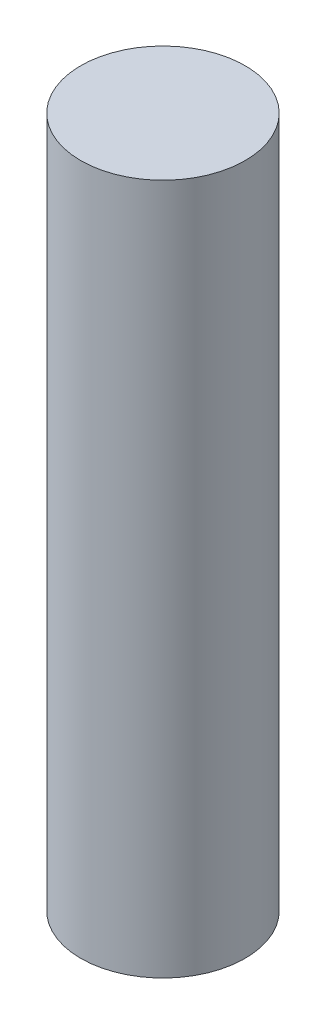
ISO-10303-21;
HEADER;
FILE_DESCRIPTION(('STEP AP214'),'2;1');
FILE_NAME('part.step','',(''),(''),'','','');
FILE_SCHEMA(('AUTOMOTIVE_DESIGN { 1 0 10303 214 1 1 1 1 }'));
ENDSEC;
DATA;
#1=APPLICATION_CONTEXT('core data for automotive mechanical design processes');
#2=APPLICATION_PROTOCOL_DEFINITION('international standard','automotive_design',2000,#1);
#3=PRODUCT_CONTEXT('',#1,'mechanical');
#4=PRODUCT('Part','Part','',(#3));
#5=PRODUCT_RELATED_PRODUCT_CATEGORY('part','',(#4));
#6=PRODUCT_DEFINITION_FORMATION('','',#4);
#7=PRODUCT_DEFINITION_CONTEXT('part definition',#1,'design');
#8=PRODUCT_DEFINITION('design','',#6,#7);
#9=PRODUCT_DEFINITION_SHAPE('','',#8);
#10=(LENGTH_UNIT() NAMED_UNIT(*) SI_UNIT(.MILLI.,.METRE.));
#11=(NAMED_UNIT(*) PLANE_ANGLE_UNIT() SI_UNIT($,.RADIAN.));
#12=(NAMED_UNIT(*) SI_UNIT($,.STERADIAN.) SOLID_ANGLE_UNIT());
#13=UNCERTAINTY_MEASURE_WITH_UNIT(LENGTH_MEASURE(1.E-05),#10,'distance_accuracy_value','');
#14=(GEOMETRIC_REPRESENTATION_CONTEXT(3) GLOBAL_UNCERTAINTY_ASSIGNED_CONTEXT((#13)) GLOBAL_UNIT_ASSIGNED_CONTEXT((#10,
#11,#12)) REPRESENTATION_CONTEXT('',''));
#15=CARTESIAN_POINT('',(0.,0.,0.));
#16=DIRECTION('',(0.,0.,1.));
#17=DIRECTION('',(1.,0.,0.));
#18=AXIS2_PLACEMENT_3D('',#15,#16,#17);
#19=CARTESIAN_POINT('',(0.,100.,0.));
#20=DIRECTION('',(0.,-1.,0.));
#21=DIRECTION('',(0.,0.,-1.));
#22=AXIS2_PLACEMENT_3D('',#19,#20,#21);
#23=CYLINDRICAL_SURFACE('',#22,11.9);
#24=CARTESIAN_POINT('',(0.,100.,0.));
#25=DIRECTION('',(0.,1.,0.));
#26=DIRECTION('',(0.,0.,1.));
#27=AXIS2_PLACEMENT_3D('',#24,#25,#26);
#28=CIRCLE('',#27,11.9);
#29=CARTESIAN_POINT('',(0.,100.,11.9));
#30=VERTEX_POINT('',#29);
#31=EDGE_CURVE('E10',#30,#30,#28,.T.);
#32=ORIENTED_EDGE('',*,*,#31,.F.);
#33=EDGE_LOOP('',(#32));
#34=FACE_BOUND('',#33,.T.);
#35=CARTESIAN_POINT('',(0.,0.,0.));
#36=DIRECTION('',(0.,1.,0.));
#37=DIRECTION('',(0.,0.,1.));
#38=AXIS2_PLACEMENT_3D('',#35,#36,#37);
#39=CIRCLE('',#38,11.9);
#40=CARTESIAN_POINT('',(0.,0.,11.9));
#41=VERTEX_POINT('',#40);
#42=EDGE_CURVE('E34',#41,#41,#39,.T.);
#43=ORIENTED_EDGE('',*,*,#42,.T.);
#44=EDGE_LOOP('',(#43));
#45=FACE_BOUND('',#44,.T.);
#46=ADVANCED_FACE('F31',(#34,#45),#23,.T.);
#47=CARTESIAN_POINT('',(0.,100.,0.));
#48=DIRECTION('',(0.,1.,0.));
#49=DIRECTION('',(0.,0.,1.));
#50=AXIS2_PLACEMENT_3D('',#47,#48,#49);
#51=PLANE('',#50);
#52=ORIENTED_EDGE('',*,*,#31,.T.);
#53=EDGE_LOOP('',(#52));
#54=FACE_BOUND('',#53,.T.);
#55=ADVANCED_FACE('F46',(#54),#51,.T.);
#56=CARTESIAN_POINT('',(0.,0.,0.));
#57=DIRECTION('',(0.,1.,0.));
#58=DIRECTION('',(0.,0.,1.));
#59=AXIS2_PLACEMENT_3D('',#56,#57,#58);
#60=PLANE('',#59);
#61=ORIENTED_EDGE('',*,*,#42,.F.);
#62=EDGE_LOOP('',(#61));
#63=FACE_BOUND('',#62,.T.);
#64=ADVANCED_FACE('F44',(#63),#60,.F.);
#65=CLOSED_SHELL('',(#46,#55,#64));
#66=MANIFOLD_SOLID_BREP('B2',#65);
#67=ADVANCED_BREP_SHAPE_REPRESENTATION('',(#18,#66),#14);
#68=SHAPE_DEFINITION_REPRESENTATION(#9,#67);
ENDSEC;
END-ISO-10303-21;
